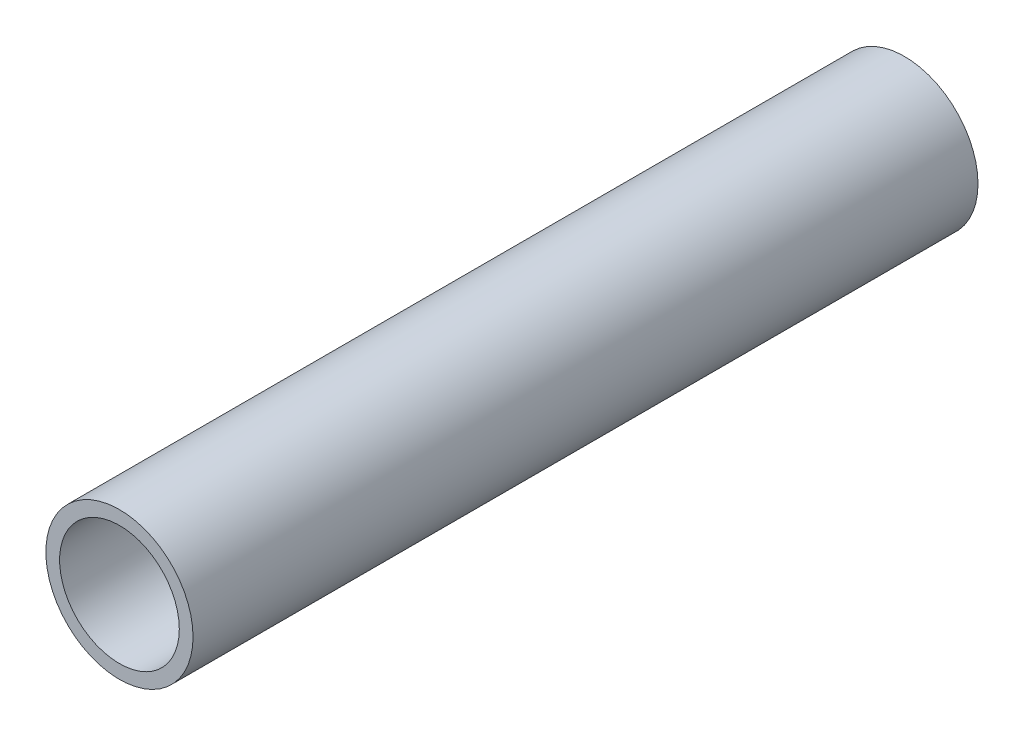
ISO-10303-21;
HEADER;
FILE_DESCRIPTION(('STEP AP214'),'2;1');
FILE_NAME('part.step','',(''),(''),'','','');
FILE_SCHEMA(('AUTOMOTIVE_DESIGN { 1 0 10303 214 1 1 1 1 }'));
ENDSEC;
DATA;
#1=APPLICATION_CONTEXT('core data for automotive mechanical design processes');
#2=APPLICATION_PROTOCOL_DEFINITION('international standard','automotive_design',2000,#1);
#3=PRODUCT_CONTEXT('',#1,'mechanical');
#4=PRODUCT('Part','Part','',(#3));
#5=PRODUCT_RELATED_PRODUCT_CATEGORY('part','',(#4));
#6=PRODUCT_DEFINITION_FORMATION('','',#4);
#7=PRODUCT_DEFINITION_CONTEXT('part definition',#1,'design');
#8=PRODUCT_DEFINITION('design','',#6,#7);
#9=PRODUCT_DEFINITION_SHAPE('','',#8);
#10=(LENGTH_UNIT() NAMED_UNIT(*) SI_UNIT(.MILLI.,.METRE.));
#11=(NAMED_UNIT(*) PLANE_ANGLE_UNIT() SI_UNIT($,.RADIAN.));
#12=(NAMED_UNIT(*) SI_UNIT($,.STERADIAN.) SOLID_ANGLE_UNIT());
#13=UNCERTAINTY_MEASURE_WITH_UNIT(LENGTH_MEASURE(1.E-05),#10,'distance_accuracy_value','');
#14=(GEOMETRIC_REPRESENTATION_CONTEXT(3) GLOBAL_UNCERTAINTY_ASSIGNED_CONTEXT((#13)) GLOBAL_UNIT_ASSIGNED_CONTEXT((#10,
#11,#12)) REPRESENTATION_CONTEXT('',''));
#15=CARTESIAN_POINT('',(0.,0.,0.));
#16=DIRECTION('',(0.,0.,1.));
#17=DIRECTION('',(1.,0.,0.));
#18=AXIS2_PLACEMENT_3D('',#15,#16,#17);
#19=CARTESIAN_POINT('',(0.,0.,0.));
#20=DIRECTION('',(0.,0.,1.));
#21=DIRECTION('',(1.,0.,0.));
#22=AXIS2_PLACEMENT_3D('',#19,#20,#21);
#23=CYLINDRICAL_SURFACE('',#22,7.5);
#24=CARTESIAN_POINT('',(0.,0.,0.));
#25=DIRECTION('',(0.,0.,1.));
#26=DIRECTION('',(1.,0.,0.));
#27=AXIS2_PLACEMENT_3D('',#24,#25,#26);
#28=CIRCLE('',#27,7.5);
#29=CARTESIAN_POINT('',(7.5,0.,0.));
#30=VERTEX_POINT('',#29);
#31=EDGE_CURVE('E10',#30,#30,#28,.T.);
#32=ORIENTED_EDGE('',*,*,#31,.T.);
#33=EDGE_LOOP('',(#32));
#34=FACE_BOUND('',#33,.T.);
#35=CARTESIAN_POINT('',(0.,0.,80.));
#36=DIRECTION('',(0.,0.,1.));
#37=DIRECTION('',(1.,0.,0.));
#38=AXIS2_PLACEMENT_3D('',#35,#36,#37);
#39=CIRCLE('',#38,7.5);
#40=CARTESIAN_POINT('',(7.5,0.,80.));
#41=VERTEX_POINT('',#40);
#42=EDGE_CURVE('E48',#41,#41,#39,.T.);
#43=ORIENTED_EDGE('',*,*,#42,.F.);
#44=EDGE_LOOP('',(#43));
#45=FACE_BOUND('',#44,.T.);
#46=ADVANCED_FACE('F35',(#34,#45),#23,.T.);
#47=CARTESIAN_POINT('',(0.,0.,0.));
#48=DIRECTION('',(0.,0.,1.));
#49=DIRECTION('',(1.,0.,0.));
#50=AXIS2_PLACEMENT_3D('',#47,#48,#49);
#51=CYLINDRICAL_SURFACE('',#50,6.1);
#52=CARTESIAN_POINT('',(0.,0.,0.));
#53=DIRECTION('',(0.,0.,1.));
#54=DIRECTION('',(1.,0.,0.));
#55=AXIS2_PLACEMENT_3D('',#52,#53,#54);
#56=CIRCLE('',#55,6.1);
#57=CARTESIAN_POINT('',(6.1,0.,0.));
#58=VERTEX_POINT('',#57);
#59=EDGE_CURVE('E42',#58,#58,#56,.T.);
#60=ORIENTED_EDGE('',*,*,#59,.F.);
#61=EDGE_LOOP('',(#60));
#62=FACE_BOUND('',#61,.T.);
#63=CARTESIAN_POINT('',(0.,0.,80.));
#64=DIRECTION('',(0.,0.,1.));
#65=DIRECTION('',(1.,0.,0.));
#66=AXIS2_PLACEMENT_3D('',#63,#64,#65);
#67=CIRCLE('',#66,6.1);
#68=CARTESIAN_POINT('',(6.1,0.,80.));
#69=VERTEX_POINT('',#68);
#70=EDGE_CURVE('E38',#69,#69,#67,.T.);
#71=ORIENTED_EDGE('',*,*,#70,.T.);
#72=EDGE_LOOP('',(#71));
#73=FACE_BOUND('',#72,.T.);
#74=ADVANCED_FACE('F55',(#62,#73),#51,.F.);
#75=CARTESIAN_POINT('',(7.5,0.,0.));
#76=DIRECTION('',(0.,0.,-1.));
#77=DIRECTION('',(-1.,0.,0.));
#78=AXIS2_PLACEMENT_3D('',#75,#76,#77);
#79=PLANE('',#78);
#80=ORIENTED_EDGE('',*,*,#59,.T.);
#81=EDGE_LOOP('',(#80));
#82=FACE_BOUND('',#81,.T.);
#83=ORIENTED_EDGE('',*,*,#31,.F.);
#84=EDGE_LOOP('',(#83));
#85=FACE_BOUND('',#84,.T.);
#86=ADVANCED_FACE('F59',(#82,#85),#79,.T.);
#87=CARTESIAN_POINT('',(0.,0.,80.));
#88=DIRECTION('',(0.,0.,1.));
#89=DIRECTION('',(1.,0.,0.));
#90=AXIS2_PLACEMENT_3D('',#87,#88,#89);
#91=PLANE('',#90);
#92=ORIENTED_EDGE('',*,*,#70,.F.);
#93=EDGE_LOOP('',(#92));
#94=FACE_BOUND('',#93,.T.);
#95=ORIENTED_EDGE('',*,*,#42,.T.);
#96=EDGE_LOOP('',(#95));
#97=FACE_BOUND('',#96,.T.);
#98=ADVANCED_FACE('F57',(#94,#97),#91,.T.);
#99=CLOSED_SHELL('',(#46,#74,#86,#98));
#100=MANIFOLD_SOLID_BREP('B2',#99);
#101=ADVANCED_BREP_SHAPE_REPRESENTATION('',(#18,#100),#14);
#102=SHAPE_DEFINITION_REPRESENTATION(#9,#101);
ENDSEC;
END-ISO-10303-21;
